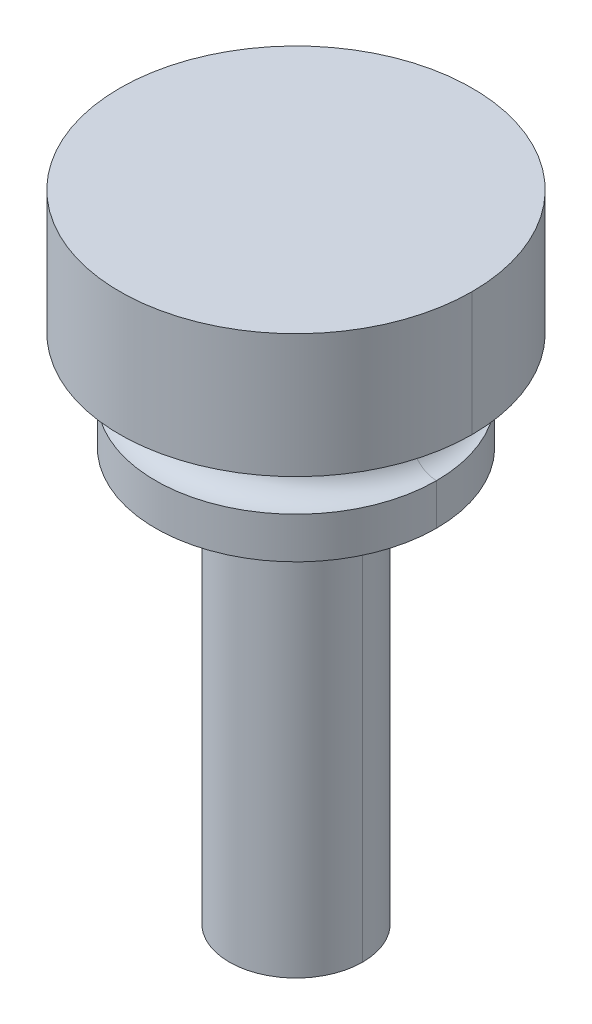
ISO-10303-21;
HEADER;
FILE_DESCRIPTION(('STEP AP214'),'2;1');
FILE_NAME('part.step','',(''),(''),'','','');
FILE_SCHEMA(('AUTOMOTIVE_DESIGN { 1 0 10303 214 1 1 1 1 }'));
ENDSEC;
DATA;
#1=APPLICATION_CONTEXT('core data for automotive mechanical design processes');
#2=APPLICATION_PROTOCOL_DEFINITION('international standard','automotive_design',2000,#1);
#3=PRODUCT_CONTEXT('',#1,'mechanical');
#4=PRODUCT('Part','Part','',(#3));
#5=PRODUCT_RELATED_PRODUCT_CATEGORY('part','',(#4));
#6=PRODUCT_DEFINITION_FORMATION('','',#4);
#7=PRODUCT_DEFINITION_CONTEXT('part definition',#1,'design');
#8=PRODUCT_DEFINITION('design','',#6,#7);
#9=PRODUCT_DEFINITION_SHAPE('','',#8);
#10=(LENGTH_UNIT() NAMED_UNIT(*) SI_UNIT(.MILLI.,.METRE.));
#11=(NAMED_UNIT(*) PLANE_ANGLE_UNIT() SI_UNIT($,.RADIAN.));
#12=(NAMED_UNIT(*) SI_UNIT($,.STERADIAN.) SOLID_ANGLE_UNIT());
#13=UNCERTAINTY_MEASURE_WITH_UNIT(LENGTH_MEASURE(1.E-05),#10,'distance_accuracy_value','');
#14=(GEOMETRIC_REPRESENTATION_CONTEXT(3) GLOBAL_UNCERTAINTY_ASSIGNED_CONTEXT((#13)) GLOBAL_UNIT_ASSIGNED_CONTEXT((#10,
#11,#12)) REPRESENTATION_CONTEXT('',''));
#15=CARTESIAN_POINT('',(0.,0.,0.));
#16=DIRECTION('',(0.,0.,1.));
#17=DIRECTION('',(1.,0.,0.));
#18=AXIS2_PLACEMENT_3D('',#15,#16,#17);
#19=CARTESIAN_POINT('',(0.,2.032,0.));
#20=DIRECTION('',(0.,-1.,0.));
#21=DIRECTION('',(1.,0.,0.));
#22=AXIS2_PLACEMENT_3D('',#19,#20,#21);
#23=TOROIDAL_SURFACE('',#22,4.32435,0.762);
#24=CARTESIAN_POINT('',(4.32435,2.032,0.));
#25=DIRECTION('',(0.,0.,-1.));
#26=DIRECTION('',(-1.,0.,0.));
#27=AXIS2_PLACEMENT_3D('',#24,#25,#26);
#28=CIRCLE('',#27,0.762);
#29=CARTESIAN_POINT('',(4.32435,1.27,0.));
#30=VERTEX_POINT('',#29);
#31=CARTESIAN_POINT('',(3.56235,2.032,0.));
#32=VERTEX_POINT('',#31);
#33=EDGE_CURVE('E10',#30,#32,#28,.T.);
#34=ORIENTED_EDGE('',*,*,#33,.T.);
#35=CARTESIAN_POINT('',(0.,2.032,0.));
#36=DIRECTION('',(0.,-1.,0.));
#37=DIRECTION('',(1.,0.,0.));
#38=AXIS2_PLACEMENT_3D('',#35,#36,#37);
#39=CIRCLE('',#38,3.56235);
#40=CARTESIAN_POINT('',(-3.56235,2.032,0.));
#41=VERTEX_POINT('',#40);
#42=EDGE_CURVE('E30',#32,#41,#39,.T.);
#43=ORIENTED_EDGE('',*,*,#42,.T.);
#44=CARTESIAN_POINT('',(-4.32435,2.032,0.));
#45=DIRECTION('',(0.,0.,1.));
#46=DIRECTION('',(1.,0.,0.));
#47=AXIS2_PLACEMENT_3D('',#44,#45,#46);
#48=CIRCLE('',#47,0.762);
#49=CARTESIAN_POINT('',(-4.32435,1.27,0.));
#50=VERTEX_POINT('',#49);
#51=EDGE_CURVE('E171',#50,#41,#48,.T.);
#52=ORIENTED_EDGE('',*,*,#51,.F.);
#53=CARTESIAN_POINT('',(0.,1.27,0.));
#54=DIRECTION('',(0.,-1.,0.));
#55=DIRECTION('',(1.,0.,0.));
#56=AXIS2_PLACEMENT_3D('',#53,#54,#55);
#57=CIRCLE('',#56,4.32435);
#58=EDGE_CURVE('E143',#30,#50,#57,.T.);
#59=ORIENTED_EDGE('',*,*,#58,.F.);
#60=EDGE_LOOP('',(#34,#43,#52,#59));
#61=FACE_BOUND('',#60,.T.);
#62=ADVANCED_FACE('F16',(#61),#23,.F.);
#63=CARTESIAN_POINT('',(0.,2.032,0.));
#64=DIRECTION('',(0.,-1.,0.));
#65=DIRECTION('',(1.,0.,0.));
#66=AXIS2_PLACEMENT_3D('',#63,#64,#65);
#67=TOROIDAL_SURFACE('',#66,4.32435,0.762);
#68=ORIENTED_EDGE('',*,*,#51,.T.);
#69=CARTESIAN_POINT('',(0.,2.032,0.));
#70=DIRECTION('',(0.,-1.,0.));
#71=DIRECTION('',(1.,0.,0.));
#72=AXIS2_PLACEMENT_3D('',#69,#70,#71);
#73=CIRCLE('',#72,3.56235);
#74=EDGE_CURVE('E45',#41,#32,#73,.T.);
#75=ORIENTED_EDGE('',*,*,#74,.T.);
#76=ORIENTED_EDGE('',*,*,#33,.F.);
#77=CARTESIAN_POINT('',(0.,1.27,0.));
#78=DIRECTION('',(0.,-1.,0.));
#79=DIRECTION('',(1.,0.,0.));
#80=AXIS2_PLACEMENT_3D('',#77,#78,#79);
#81=CIRCLE('',#80,4.32435);
#82=EDGE_CURVE('E192',#50,#30,#81,.T.);
#83=ORIENTED_EDGE('',*,*,#82,.F.);
#84=EDGE_LOOP('',(#68,#75,#76,#83));
#85=FACE_BOUND('',#84,.T.);
#86=ADVANCED_FACE('F210',(#85),#67,.F.);
#87=CARTESIAN_POINT('',(0.,-12.7,0.));
#88=DIRECTION('',(0.,-1.,0.));
#89=DIRECTION('',(1.,0.,0.));
#90=AXIS2_PLACEMENT_3D('',#87,#88,#89);
#91=CYLINDRICAL_SURFACE('',#90,2.05105);
#92=CARTESIAN_POINT('',(0.,0.,0.));
#93=DIRECTION('',(0.,-1.,0.));
#94=DIRECTION('',(1.,0.,0.));
#95=AXIS2_PLACEMENT_3D('',#92,#93,#94);
#96=CIRCLE('',#95,2.05105);
#97=CARTESIAN_POINT('',(2.05105,0.,0.));
#98=VERTEX_POINT('',#97);
#99=CARTESIAN_POINT('',(-2.05105,0.,0.));
#100=VERTEX_POINT('',#99);
#101=EDGE_CURVE('E138',#98,#100,#96,.T.);
#102=ORIENTED_EDGE('',*,*,#101,.T.);
#103=DIRECTION('',(0.,-1.,0.));
#104=VECTOR('',#103,1.);
#105=CARTESIAN_POINT('',(-2.05105,-12.7,0.));
#106=LINE('',#105,#104);
#107=CARTESIAN_POINT('',(-2.05105,-12.7,0.));
#108=VERTEX_POINT('',#107);
#109=EDGE_CURVE('E129',#100,#108,#106,.T.);
#110=ORIENTED_EDGE('',*,*,#109,.T.);
#111=CARTESIAN_POINT('',(0.,-12.7,0.));
#112=DIRECTION('',(0.,-1.,0.));
#113=DIRECTION('',(1.,0.,0.));
#114=AXIS2_PLACEMENT_3D('',#111,#112,#113);
#115=CIRCLE('',#114,2.05105);
#116=CARTESIAN_POINT('',(2.05105,-12.7,0.));
#117=VERTEX_POINT('',#116);
#118=EDGE_CURVE('E159',#117,#108,#115,.T.);
#119=ORIENTED_EDGE('',*,*,#118,.F.);
#120=DIRECTION('',(0.,-1.,0.));
#121=VECTOR('',#120,1.);
#122=CARTESIAN_POINT('',(2.05105,-12.7,0.));
#123=LINE('',#122,#121);
#124=EDGE_CURVE('E144',#98,#117,#123,.T.);
#125=ORIENTED_EDGE('',*,*,#124,.F.);
#126=EDGE_LOOP('',(#102,#110,#119,#125));
#127=FACE_BOUND('',#126,.T.);
#128=ADVANCED_FACE('F145',(#127),#91,.T.);
#129=CARTESIAN_POINT('',(0.,-12.7,0.));
#130=DIRECTION('',(0.,-1.,0.));
#131=DIRECTION('',(1.,0.,0.));
#132=AXIS2_PLACEMENT_3D('',#129,#130,#131);
#133=CYLINDRICAL_SURFACE('',#132,4.32435);
#134=ORIENTED_EDGE('',*,*,#58,.T.);
#135=DIRECTION('',(0.,-1.,0.));
#136=VECTOR('',#135,1.);
#137=CARTESIAN_POINT('',(-4.32435,-12.7,0.));
#138=LINE('',#137,#136);
#139=CARTESIAN_POINT('',(-4.32435,0.,0.));
#140=VERTEX_POINT('',#139);
#141=EDGE_CURVE('E185',#50,#140,#138,.T.);
#142=ORIENTED_EDGE('',*,*,#141,.T.);
#143=CARTESIAN_POINT('',(0.,0.,0.));
#144=DIRECTION('',(0.,-1.,0.));
#145=DIRECTION('',(1.,0.,0.));
#146=AXIS2_PLACEMENT_3D('',#143,#144,#145);
#147=CIRCLE('',#146,4.32435);
#148=CARTESIAN_POINT('',(4.32435,0.,0.));
#149=VERTEX_POINT('',#148);
#150=EDGE_CURVE('E106',#149,#140,#147,.T.);
#151=ORIENTED_EDGE('',*,*,#150,.F.);
#152=DIRECTION('',(0.,-1.,0.));
#153=VECTOR('',#152,1.);
#154=CARTESIAN_POINT('',(4.32435,-12.7,0.));
#155=LINE('',#154,#153);
#156=EDGE_CURVE('E188',#30,#149,#155,.T.);
#157=ORIENTED_EDGE('',*,*,#156,.F.);
#158=EDGE_LOOP('',(#134,#142,#151,#157));
#159=FACE_BOUND('',#158,.T.);
#160=ADVANCED_FACE('F225',(#159),#133,.T.);
#161=CARTESIAN_POINT('',(0.,2.032,0.));
#162=DIRECTION('',(0.,-1.,0.));
#163=DIRECTION('',(1.,0.,0.));
#164=AXIS2_PLACEMENT_3D('',#161,#162,#163);
#165=TOROIDAL_SURFACE('',#164,4.32435,0.762);
#166=ORIENTED_EDGE('',*,*,#74,.F.);
#167=CARTESIAN_POINT('',(-4.32435,2.032,0.));
#168=DIRECTION('',(0.,0.,1.));
#169=DIRECTION('',(1.,0.,0.));
#170=AXIS2_PLACEMENT_3D('',#167,#168,#169);
#171=CIRCLE('',#170,0.762);
#172=CARTESIAN_POINT('',(-4.32435,2.794,0.));
#173=VERTEX_POINT('',#172);
#174=EDGE_CURVE('E250',#41,#173,#171,.T.);
#175=ORIENTED_EDGE('',*,*,#174,.T.);
#176=CARTESIAN_POINT('',(0.,2.794,0.));
#177=DIRECTION('',(0.,-1.,0.));
#178=DIRECTION('',(1.,0.,0.));
#179=AXIS2_PLACEMENT_3D('',#176,#177,#178);
#180=CIRCLE('',#179,4.32435);
#181=CARTESIAN_POINT('',(4.32435,2.794,0.));
#182=VERTEX_POINT('',#181);
#183=EDGE_CURVE('E259',#173,#182,#180,.T.);
#184=ORIENTED_EDGE('',*,*,#183,.T.);
#185=CARTESIAN_POINT('',(4.32435,2.032,0.));
#186=DIRECTION('',(0.,0.,-1.));
#187=DIRECTION('',(-1.,0.,0.));
#188=AXIS2_PLACEMENT_3D('',#185,#186,#187);
#189=CIRCLE('',#188,0.762);
#190=EDGE_CURVE('E248',#32,#182,#189,.T.);
#191=ORIENTED_EDGE('',*,*,#190,.F.);
#192=EDGE_LOOP('',(#166,#175,#184,#191));
#193=FACE_BOUND('',#192,.T.);
#194=ADVANCED_FACE('F231',(#193),#165,.F.);
#195=CARTESIAN_POINT('',(0.,-12.7,0.));
#196=DIRECTION('',(0.,-1.,0.));
#197=DIRECTION('',(1.,0.,0.));
#198=AXIS2_PLACEMENT_3D('',#195,#196,#197);
#199=CYLINDRICAL_SURFACE('',#198,4.32435);
#200=CARTESIAN_POINT('',(0.,3.048,0.));
#201=DIRECTION('',(0.,-1.,0.));
#202=DIRECTION('',(1.,0.,0.));
#203=AXIS2_PLACEMENT_3D('',#200,#201,#202);
#204=CIRCLE('',#203,4.32435);
#205=CARTESIAN_POINT('',(4.32435,3.048,0.));
#206=VERTEX_POINT('',#205);
#207=CARTESIAN_POINT('',(-4.32435,3.048,0.));
#208=VERTEX_POINT('',#207);
#209=EDGE_CURVE('E175',#206,#208,#204,.T.);
#210=ORIENTED_EDGE('',*,*,#209,.T.);
#211=DIRECTION('',(0.,-1.,0.));
#212=VECTOR('',#211,1.);
#213=CARTESIAN_POINT('',(-4.32435,-12.7,0.));
#214=LINE('',#213,#212);
#215=EDGE_CURVE('E172',#208,#173,#214,.T.);
#216=ORIENTED_EDGE('',*,*,#215,.T.);
#217=CARTESIAN_POINT('',(0.,2.794,0.));
#218=DIRECTION('',(0.,-1.,0.));
#219=DIRECTION('',(1.,0.,0.));
#220=AXIS2_PLACEMENT_3D('',#217,#218,#219);
#221=CIRCLE('',#220,4.32435);
#222=EDGE_CURVE('E260',#182,#173,#221,.T.);
#223=ORIENTED_EDGE('',*,*,#222,.F.);
#224=DIRECTION('',(0.,-1.,0.));
#225=VECTOR('',#224,1.);
#226=CARTESIAN_POINT('',(4.32435,-12.7,0.));
#227=LINE('',#226,#225);
#228=EDGE_CURVE('E277',#206,#182,#227,.T.);
#229=ORIENTED_EDGE('',*,*,#228,.F.);
#230=EDGE_LOOP('',(#210,#216,#223,#229));
#231=FACE_BOUND('',#230,.T.);
#232=ADVANCED_FACE('F233',(#231),#199,.T.);
#233=CARTESIAN_POINT('',(0.,-12.7,0.));
#234=DIRECTION('',(0.,-1.,0.));
#235=DIRECTION('',(1.,0.,0.));
#236=AXIS2_PLACEMENT_3D('',#233,#234,#235);
#237=CYLINDRICAL_SURFACE('',#236,5.4229);
#238=CARTESIAN_POINT('',(0.,6.858,0.));
#239=DIRECTION('',(0.,-1.,0.));
#240=DIRECTION('',(1.,0.,0.));
#241=AXIS2_PLACEMENT_3D('',#238,#239,#240);
#242=CIRCLE('',#241,5.4229);
#243=CARTESIAN_POINT('',(5.4229,6.858,0.));
#244=VERTEX_POINT('',#243);
#245=CARTESIAN_POINT('',(-5.4229,6.858,0.));
#246=VERTEX_POINT('',#245);
#247=EDGE_CURVE('E176',#244,#246,#242,.T.);
#248=ORIENTED_EDGE('',*,*,#247,.T.);
#249=DIRECTION('',(0.,-1.,0.));
#250=VECTOR('',#249,1.);
#251=CARTESIAN_POINT('',(-5.4229,-12.7,0.));
#252=LINE('',#251,#250);
#253=CARTESIAN_POINT('',(-5.4229,3.048,0.));
#254=VERTEX_POINT('',#253);
#255=EDGE_CURVE('E90',#246,#254,#252,.T.);
#256=ORIENTED_EDGE('',*,*,#255,.T.);
#257=CARTESIAN_POINT('',(0.,3.048,0.));
#258=DIRECTION('',(0.,-1.,0.));
#259=DIRECTION('',(1.,0.,0.));
#260=AXIS2_PLACEMENT_3D('',#257,#258,#259);
#261=CIRCLE('',#260,5.4229);
#262=CARTESIAN_POINT('',(5.4229,3.048,0.));
#263=VERTEX_POINT('',#262);
#264=EDGE_CURVE('E80',#263,#254,#261,.T.);
#265=ORIENTED_EDGE('',*,*,#264,.F.);
#266=DIRECTION('',(0.,-1.,0.));
#267=VECTOR('',#266,1.);
#268=CARTESIAN_POINT('',(5.4229,-12.7,0.));
#269=LINE('',#268,#267);
#270=EDGE_CURVE('E164',#244,#263,#269,.T.);
#271=ORIENTED_EDGE('',*,*,#270,.F.);
#272=EDGE_LOOP('',(#248,#256,#265,#271));
#273=FACE_BOUND('',#272,.T.);
#274=ADVANCED_FACE('F237',(#273),#237,.T.);
#275=CARTESIAN_POINT('',(5.4229,6.858,0.));
#276=DIRECTION('',(0.,1.,0.));
#277=DIRECTION('',(1.,0.,0.));
#278=AXIS2_PLACEMENT_3D('',#275,#276,#277);
#279=PLANE('',#278);
#280=ORIENTED_EDGE('',*,*,#247,.F.);
#281=CARTESIAN_POINT('',(0.,6.858,0.));
#282=DIRECTION('',(0.,-1.,0.));
#283=DIRECTION('',(1.,0.,0.));
#284=AXIS2_PLACEMENT_3D('',#281,#282,#283);
#285=CIRCLE('',#284,5.4229);
#286=EDGE_CURVE('E169',#246,#244,#285,.T.);
#287=ORIENTED_EDGE('',*,*,#286,.F.);
#288=EDGE_LOOP('',(#280,#287));
#289=FACE_BOUND('',#288,.T.);
#290=ADVANCED_FACE('F18',(#289),#279,.T.);
#291=CARTESIAN_POINT('',(0.,-12.7,0.));
#292=DIRECTION('',(0.,-1.,0.));
#293=DIRECTION('',(1.,0.,0.));
#294=AXIS2_PLACEMENT_3D('',#291,#292,#293);
#295=CYLINDRICAL_SURFACE('',#294,5.4229);
#296=ORIENTED_EDGE('',*,*,#255,.F.);
#297=ORIENTED_EDGE('',*,*,#286,.T.);
#298=ORIENTED_EDGE('',*,*,#270,.T.);
#299=CARTESIAN_POINT('',(0.,3.048,0.));
#300=DIRECTION('',(0.,-1.,0.));
#301=DIRECTION('',(1.,0.,0.));
#302=AXIS2_PLACEMENT_3D('',#299,#300,#301);
#303=CIRCLE('',#302,5.4229);
#304=EDGE_CURVE('E20',#254,#263,#303,.T.);
#305=ORIENTED_EDGE('',*,*,#304,.F.);
#306=EDGE_LOOP('',(#296,#297,#298,#305));
#307=FACE_BOUND('',#306,.T.);
#308=ADVANCED_FACE('F223',(#307),#295,.T.);
#309=CARTESIAN_POINT('',(4.32435,3.048,0.));
#310=DIRECTION('',(0.,-1.,0.));
#311=DIRECTION('',(-1.,0.,0.));
#312=AXIS2_PLACEMENT_3D('',#309,#310,#311);
#313=PLANE('',#312);
#314=ORIENTED_EDGE('',*,*,#264,.T.);
#315=ORIENTED_EDGE('',*,*,#304,.T.);
#316=EDGE_LOOP('',(#314,#315));
#317=FACE_BOUND('',#316,.T.);
#318=ORIENTED_EDGE('',*,*,#209,.F.);
#319=CARTESIAN_POINT('',(0.,3.048,0.));
#320=DIRECTION('',(0.,-1.,0.));
#321=DIRECTION('',(1.,0.,0.));
#322=AXIS2_PLACEMENT_3D('',#319,#320,#321);
#323=CIRCLE('',#322,4.32435);
#324=EDGE_CURVE('E278',#208,#206,#323,.T.);
#325=ORIENTED_EDGE('',*,*,#324,.F.);
#326=EDGE_LOOP('',(#318,#325));
#327=FACE_BOUND('',#326,.T.);
#328=ADVANCED_FACE('F217',(#317,#327),#313,.T.);
#329=CARTESIAN_POINT('',(0.,-12.7,0.));
#330=DIRECTION('',(0.,-1.,0.));
#331=DIRECTION('',(1.,0.,0.));
#332=AXIS2_PLACEMENT_3D('',#329,#330,#331);
#333=CYLINDRICAL_SURFACE('',#332,4.32435);
#334=ORIENTED_EDGE('',*,*,#215,.F.);
#335=ORIENTED_EDGE('',*,*,#324,.T.);
#336=ORIENTED_EDGE('',*,*,#228,.T.);
#337=ORIENTED_EDGE('',*,*,#183,.F.);
#338=EDGE_LOOP('',(#334,#335,#336,#337));
#339=FACE_BOUND('',#338,.T.);
#340=ADVANCED_FACE('F212',(#339),#333,.T.);
#341=CARTESIAN_POINT('',(0.,2.032,0.));
#342=DIRECTION('',(0.,-1.,0.));
#343=DIRECTION('',(1.,0.,0.));
#344=AXIS2_PLACEMENT_3D('',#341,#342,#343);
#345=TOROIDAL_SURFACE('',#344,4.32435,0.762);
#346=ORIENTED_EDGE('',*,*,#42,.F.);
#347=ORIENTED_EDGE('',*,*,#190,.T.);
#348=ORIENTED_EDGE('',*,*,#222,.T.);
#349=ORIENTED_EDGE('',*,*,#174,.F.);
#350=EDGE_LOOP('',(#346,#347,#348,#349));
#351=FACE_BOUND('',#350,.T.);
#352=ADVANCED_FACE('F220',(#351),#345,.F.);
#353=CARTESIAN_POINT('',(0.,-12.7,0.));
#354=DIRECTION('',(0.,-1.,0.));
#355=DIRECTION('',(1.,0.,0.));
#356=AXIS2_PLACEMENT_3D('',#353,#354,#355);
#357=CYLINDRICAL_SURFACE('',#356,4.32435);
#358=ORIENTED_EDGE('',*,*,#141,.F.);
#359=ORIENTED_EDGE('',*,*,#82,.T.);
#360=ORIENTED_EDGE('',*,*,#156,.T.);
#361=CARTESIAN_POINT('',(0.,0.,0.));
#362=DIRECTION('',(0.,-1.,0.));
#363=DIRECTION('',(1.,0.,0.));
#364=AXIS2_PLACEMENT_3D('',#361,#362,#363);
#365=CIRCLE('',#364,4.32435);
#366=EDGE_CURVE('E151',#140,#149,#365,.T.);
#367=ORIENTED_EDGE('',*,*,#366,.F.);
#368=EDGE_LOOP('',(#358,#359,#360,#367));
#369=FACE_BOUND('',#368,.T.);
#370=ADVANCED_FACE('F229',(#369),#357,.T.);
#371=CARTESIAN_POINT('',(2.05105,0.,0.));
#372=DIRECTION('',(0.,-1.,0.));
#373=DIRECTION('',(-1.,0.,0.));
#374=AXIS2_PLACEMENT_3D('',#371,#372,#373);
#375=PLANE('',#374);
#376=ORIENTED_EDGE('',*,*,#150,.T.);
#377=ORIENTED_EDGE('',*,*,#366,.T.);
#378=EDGE_LOOP('',(#376,#377));
#379=FACE_BOUND('',#378,.T.);
#380=ORIENTED_EDGE('',*,*,#101,.F.);
#381=CARTESIAN_POINT('',(0.,0.,0.));
#382=DIRECTION('',(0.,-1.,0.));
#383=DIRECTION('',(1.,0.,0.));
#384=AXIS2_PLACEMENT_3D('',#381,#382,#383);
#385=CIRCLE('',#384,2.05105);
#386=EDGE_CURVE('E134',#100,#98,#385,.T.);
#387=ORIENTED_EDGE('',*,*,#386,.F.);
#388=EDGE_LOOP('',(#380,#387));
#389=FACE_BOUND('',#388,.T.);
#390=ADVANCED_FACE('F149',(#379,#389),#375,.T.);
#391=CARTESIAN_POINT('',(0.,-12.7,0.));
#392=DIRECTION('',(0.,-1.,0.));
#393=DIRECTION('',(1.,0.,0.));
#394=AXIS2_PLACEMENT_3D('',#391,#392,#393);
#395=CYLINDRICAL_SURFACE('',#394,2.05105);
#396=ORIENTED_EDGE('',*,*,#109,.F.);
#397=ORIENTED_EDGE('',*,*,#386,.T.);
#398=ORIENTED_EDGE('',*,*,#124,.T.);
#399=CARTESIAN_POINT('',(0.,-12.7,0.));
#400=DIRECTION('',(0.,-1.,0.));
#401=DIRECTION('',(1.,0.,0.));
#402=AXIS2_PLACEMENT_3D('',#399,#400,#401);
#403=CIRCLE('',#402,2.05105);
#404=EDGE_CURVE('E140',#108,#117,#403,.T.);
#405=ORIENTED_EDGE('',*,*,#404,.F.);
#406=EDGE_LOOP('',(#396,#397,#398,#405));
#407=FACE_BOUND('',#406,.T.);
#408=ADVANCED_FACE('F135',(#407),#395,.T.);
#409=CARTESIAN_POINT('',(0.,-12.7,0.));
#410=DIRECTION('',(0.,-1.,0.));
#411=DIRECTION('',(-1.,0.,0.));
#412=AXIS2_PLACEMENT_3D('',#409,#410,#411);
#413=PLANE('',#412);
#414=ORIENTED_EDGE('',*,*,#118,.T.);
#415=ORIENTED_EDGE('',*,*,#404,.T.);
#416=EDGE_LOOP('',(#414,#415));
#417=FACE_BOUND('',#416,.T.);
#418=ADVANCED_FACE('F197',(#417),#413,.T.);
#419=CLOSED_SHELL('',(#62,#86,#128,#160,#194,#232,#274,#290,#308,#328,#340,#352,#370,#390,#408,#418));
#420=MANIFOLD_SOLID_BREP('B1',#419);
#421=ADVANCED_BREP_SHAPE_REPRESENTATION('',(#18,#420),#14);
#422=SHAPE_DEFINITION_REPRESENTATION(#9,#421);
ENDSEC;
END-ISO-10303-21;
